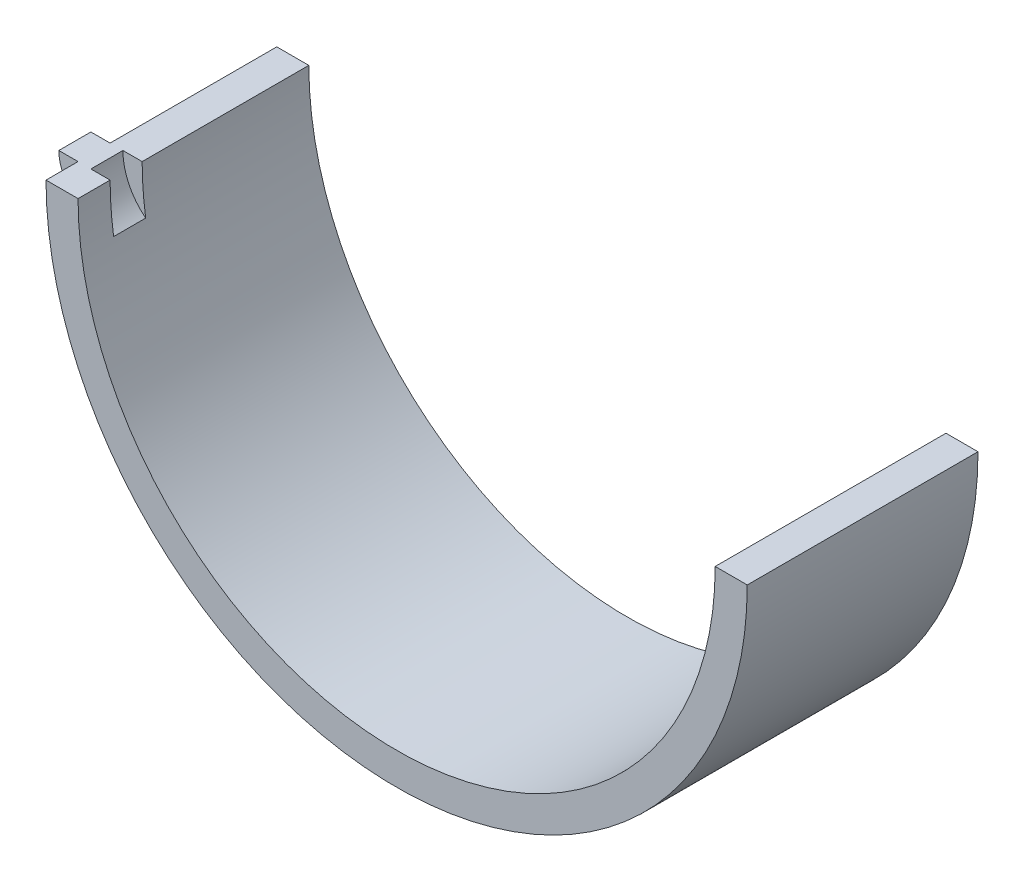
ISO-10303-21;
HEADER;
FILE_DESCRIPTION(('STEP AP214'),'2;1');
FILE_NAME('part.step','',(''),(''),'','','');
FILE_SCHEMA(('AUTOMOTIVE_DESIGN { 1 0 10303 214 1 1 1 1 }'));
ENDSEC;
DATA;
#1=APPLICATION_CONTEXT('core data for automotive mechanical design processes');
#2=APPLICATION_PROTOCOL_DEFINITION('international standard','automotive_design',2000,#1);
#3=PRODUCT_CONTEXT('',#1,'mechanical');
#4=PRODUCT('Part','Part','',(#3));
#5=PRODUCT_RELATED_PRODUCT_CATEGORY('part','',(#4));
#6=PRODUCT_DEFINITION_FORMATION('','',#4);
#7=PRODUCT_DEFINITION_CONTEXT('part definition',#1,'design');
#8=PRODUCT_DEFINITION('design','',#6,#7);
#9=PRODUCT_DEFINITION_SHAPE('','',#8);
#10=(LENGTH_UNIT() NAMED_UNIT(*) SI_UNIT(.MILLI.,.METRE.));
#11=(NAMED_UNIT(*) PLANE_ANGLE_UNIT() SI_UNIT($,.RADIAN.));
#12=(NAMED_UNIT(*) SI_UNIT($,.STERADIAN.) SOLID_ANGLE_UNIT());
#13=UNCERTAINTY_MEASURE_WITH_UNIT(LENGTH_MEASURE(1.E-05),#10,'distance_accuracy_value','');
#14=(GEOMETRIC_REPRESENTATION_CONTEXT(3) GLOBAL_UNCERTAINTY_ASSIGNED_CONTEXT((#13)) GLOBAL_UNIT_ASSIGNED_CONTEXT((#10,
#11,#12)) REPRESENTATION_CONTEXT('',''));
#15=CARTESIAN_POINT('',(0.,0.,0.));
#16=DIRECTION('',(0.,0.,1.));
#17=DIRECTION('',(1.,0.,0.));
#18=AXIS2_PLACEMENT_3D('',#15,#16,#17);
#19=CARTESIAN_POINT('',(-13.8938,13.8938,-9.144));
#20=DIRECTION('',(0.,1.,0.));
#21=DIRECTION('',(-0.999999999999943,0.,0.));
#22=AXIS2_PLACEMENT_3D('',#19,#20,#21);
#23=PLANE('',#22);
#24=DIRECTION('',(0.,0.,1.));
#25=VECTOR('',#24,1.);
#26=CARTESIAN_POINT('',(-13.3858,13.8938,-2.54));
#27=LINE('',#26,#25);
#28=CARTESIAN_POINT('',(-13.3858,13.8938,-2.54));
#29=VERTEX_POINT('',#28);
#30=CARTESIAN_POINT('',(-13.3858,13.8938,-1.26999999999999));
#31=VERTEX_POINT('',#30);
#32=EDGE_CURVE('E133',#29,#31,#27,.T.);
#33=ORIENTED_EDGE('',*,*,#32,.F.);
#34=DIRECTION('',(0.999999999999943,0.,0.));
#35=VECTOR('',#34,1.);
#36=CARTESIAN_POINT('',(-13.3858,13.8938,-2.54));
#37=LINE('',#36,#35);
#38=CARTESIAN_POINT('',(-12.6238,13.8938,-2.54));
#39=VERTEX_POINT('',#38);
#40=EDGE_CURVE('E121',#29,#39,#37,.T.);
#41=ORIENTED_EDGE('',*,*,#40,.T.);
#42=DIRECTION('',(0.,0.,1.));
#43=VECTOR('',#42,1.);
#44=CARTESIAN_POINT('',(-12.6238,13.8938,-9.144));
#45=LINE('',#44,#43);
#46=CARTESIAN_POINT('',(-12.6238,13.8938,-9.144));
#47=VERTEX_POINT('',#46);
#48=EDGE_CURVE('E131',#47,#39,#45,.T.);
#49=ORIENTED_EDGE('',*,*,#48,.F.);
#50=DIRECTION('',(-0.999999999999943,0.,0.));
#51=VECTOR('',#50,1.);
#52=CARTESIAN_POINT('',(-13.8938,13.8938,-9.144));
#53=LINE('',#52,#51);
#54=CARTESIAN_POINT('',(-13.8938,13.8938,-9.144));
#55=VERTEX_POINT('',#54);
#56=EDGE_CURVE('E148',#47,#55,#53,.T.);
#57=ORIENTED_EDGE('',*,*,#56,.T.);
#58=DIRECTION('',(0.,0.,1.));
#59=VECTOR('',#58,1.);
#60=CARTESIAN_POINT('',(-13.8938,13.8938,-9.144));
#61=LINE('',#60,#59);
#62=CARTESIAN_POINT('',(-13.8938,13.8938,-2.54));
#63=VERTEX_POINT('',#62);
#64=EDGE_CURVE('E11',#55,#63,#61,.T.);
#65=ORIENTED_EDGE('',*,*,#64,.T.);
#66=DIRECTION('',(-0.999999999999943,0.,0.));
#67=VECTOR('',#66,1.);
#68=CARTESIAN_POINT('',(-13.8938,13.8938,-2.54));
#69=LINE('',#68,#67);
#70=CARTESIAN_POINT('',(-14.6558,13.8938,-2.54));
#71=VERTEX_POINT('',#70);
#72=EDGE_CURVE('E187',#63,#71,#69,.T.);
#73=ORIENTED_EDGE('',*,*,#72,.T.);
#74=DIRECTION('',(0.,0.,1.));
#75=VECTOR('',#74,1.);
#76=CARTESIAN_POINT('',(-14.6558,13.8938,-2.54));
#77=LINE('',#76,#75);
#78=CARTESIAN_POINT('',(-14.6558,13.8938,-1.26999999999999));
#79=VERTEX_POINT('',#78);
#80=EDGE_CURVE('E174',#71,#79,#77,.T.);
#81=ORIENTED_EDGE('',*,*,#80,.T.);
#82=DIRECTION('',(-0.999999999999943,0.,0.));
#83=VECTOR('',#82,1.);
#84=CARTESIAN_POINT('',(-13.8938,13.8938,-1.26999999999999));
#85=LINE('',#84,#83);
#86=CARTESIAN_POINT('',(-13.8938,13.8938,-1.26999999999999));
#87=VERTEX_POINT('',#86);
#88=EDGE_CURVE('E181',#87,#79,#85,.T.);
#89=ORIENTED_EDGE('',*,*,#88,.F.);
#90=CARTESIAN_POINT('',(-13.8938,13.8938,0.));
#91=VERTEX_POINT('',#90);
#92=EDGE_CURVE('E45',#87,#91,#61,.T.);
#93=ORIENTED_EDGE('',*,*,#92,.T.);
#94=DIRECTION('',(-0.999999999999943,0.,0.));
#95=VECTOR('',#94,1.);
#96=CARTESIAN_POINT('',(-13.8938,13.8938,0.));
#97=LINE('',#96,#95);
#98=CARTESIAN_POINT('',(-12.6238,13.8938,0.));
#99=VERTEX_POINT('',#98);
#100=EDGE_CURVE('E166',#99,#91,#97,.T.);
#101=ORIENTED_EDGE('',*,*,#100,.F.);
#102=CARTESIAN_POINT('',(-12.6238,13.8938,-1.26999999999999));
#103=VERTEX_POINT('',#102);
#104=EDGE_CURVE('E140',#103,#99,#45,.T.);
#105=ORIENTED_EDGE('',*,*,#104,.F.);
#106=DIRECTION('',(0.999999999999943,0.,0.));
#107=VECTOR('',#106,1.);
#108=CARTESIAN_POINT('',(-13.3858,13.8938,-1.26999999999999));
#109=LINE('',#108,#107);
#110=EDGE_CURVE('E53',#31,#103,#109,.T.);
#111=ORIENTED_EDGE('',*,*,#110,.F.);
#112=EDGE_LOOP('',(#33,#41,#49,#57,#65,#73,#81,#89,#93,#101,#105,#111));
#113=FACE_BOUND('',#112,.T.);
#114=ADVANCED_FACE('F36',(#113),#23,.T.);
#115=CARTESIAN_POINT('',(-8.88178419700125E-13,13.8938,-9.144));
#116=DIRECTION('',(0.,0.,1.));
#117=DIRECTION('',(0.999999999999943,0.,0.));
#118=AXIS2_PLACEMENT_3D('',#115,#116,#117);
#119=CYLINDRICAL_SURFACE('',#118,12.6238);
#120=ORIENTED_EDGE('',*,*,#48,.T.);
#121=CARTESIAN_POINT('',(-8.88178419700125E-13,13.8938,-2.54));
#122=DIRECTION('',(0.,0.,1.));
#123=DIRECTION('',(0.999999999999943,0.,0.));
#124=AXIS2_PLACEMENT_3D('',#121,#122,#123);
#125=CIRCLE('',#124,12.6238);
#126=CARTESIAN_POINT('',(-12.4844649423711,12.0233825218131,-2.54));
#127=VERTEX_POINT('',#126);
#128=EDGE_CURVE('E118',#39,#127,#125,.T.);
#129=ORIENTED_EDGE('',*,*,#128,.T.);
#130=DIRECTION('',(0.,0.,1.));
#131=VECTOR('',#130,1.);
#132=CARTESIAN_POINT('',(-12.4844649423711,12.0233825218131,-2.54));
#133=LINE('',#132,#131);
#134=CARTESIAN_POINT('',(-12.4844649423711,12.0233825218131,-1.26999999999999));
#135=VERTEX_POINT('',#134);
#136=EDGE_CURVE('E184',#127,#135,#133,.T.);
#137=ORIENTED_EDGE('',*,*,#136,.T.);
#138=CARTESIAN_POINT('',(-8.88178419700125E-13,13.8938,-1.26999999999999));
#139=DIRECTION('',(0.,0.,1.));
#140=DIRECTION('',(0.999999999999943,0.,0.));
#141=AXIS2_PLACEMENT_3D('',#138,#139,#140);
#142=CIRCLE('',#141,12.6238);
#143=EDGE_CURVE('E196',#103,#135,#142,.T.);
#144=ORIENTED_EDGE('',*,*,#143,.F.);
#145=ORIENTED_EDGE('',*,*,#104,.T.);
#146=CARTESIAN_POINT('',(-8.84708972748172E-13,13.8938,0.));
#147=DIRECTION('',(0.,0.,-1.));
#148=DIRECTION('',(0.999999999999943,0.,0.));
#149=AXIS2_PLACEMENT_3D('',#146,#147,#148);
#150=CIRCLE('',#149,12.6238);
#151=CARTESIAN_POINT('',(12.6237999999982,13.8938,0.));
#152=VERTEX_POINT('',#151);
#153=EDGE_CURVE('E164',#152,#99,#150,.T.);
#154=ORIENTED_EDGE('',*,*,#153,.F.);
#155=DIRECTION('',(0.,0.,1.));
#156=VECTOR('',#155,1.);
#157=CARTESIAN_POINT('',(12.6237999999982,13.8938,-9.144));
#158=LINE('',#157,#156);
#159=CARTESIAN_POINT('',(12.6237999999982,13.8938,-9.144));
#160=VERTEX_POINT('',#159);
#161=EDGE_CURVE('E142',#160,#152,#158,.T.);
#162=ORIENTED_EDGE('',*,*,#161,.F.);
#163=CARTESIAN_POINT('',(-8.88178419700125E-13,13.8938,-9.144));
#164=DIRECTION('',(0.,0.,-1.));
#165=DIRECTION('',(0.999999999999943,0.,0.));
#166=AXIS2_PLACEMENT_3D('',#163,#164,#165);
#167=CIRCLE('',#166,12.6238);
#168=EDGE_CURVE('E138',#160,#47,#167,.T.);
#169=ORIENTED_EDGE('',*,*,#168,.T.);
#170=EDGE_LOOP('',(#120,#129,#137,#144,#145,#154,#162,#169));
#171=FACE_BOUND('',#170,.T.);
#172=ADVANCED_FACE('F136',(#171),#119,.F.);
#173=CARTESIAN_POINT('',(-8.88178419700125E-13,13.8938,-9.144));
#174=DIRECTION('',(0.,0.,1.));
#175=DIRECTION('',(0.999999999999943,0.,0.));
#176=AXIS2_PLACEMENT_3D('',#173,#174,#175);
#177=CYLINDRICAL_SURFACE('',#176,13.8938);
#178=DIRECTION('',(0.,0.,1.));
#179=VECTOR('',#178,1.);
#180=CARTESIAN_POINT('',(-13.8236105397417,12.498998908252,-2.54));
#181=LINE('',#180,#179);
#182=CARTESIAN_POINT('',(-13.8236105397417,12.498998908252,-2.54));
#183=VERTEX_POINT('',#182);
#184=CARTESIAN_POINT('',(-13.8236105397417,12.498998908252,-1.26999999999999));
#185=VERTEX_POINT('',#184);
#186=EDGE_CURVE('E161',#183,#185,#181,.T.);
#187=ORIENTED_EDGE('',*,*,#186,.F.);
#188=CARTESIAN_POINT('',(-8.88178419700125E-13,13.8938,-2.54));
#189=DIRECTION('',(0.,0.,-1.));
#190=DIRECTION('',(0.999999999999943,0.,0.));
#191=AXIS2_PLACEMENT_3D('',#188,#189,#190);
#192=CIRCLE('',#191,13.8938);
#193=EDGE_CURVE('E180',#183,#63,#192,.T.);
#194=ORIENTED_EDGE('',*,*,#193,.T.);
#195=ORIENTED_EDGE('',*,*,#64,.F.);
#196=CARTESIAN_POINT('',(-8.88178419700125E-13,13.8938,-9.144));
#197=DIRECTION('',(0.,0.,1.));
#198=DIRECTION('',(-0.999999999999943,0.,0.));
#199=AXIS2_PLACEMENT_3D('',#196,#197,#198);
#200=CIRCLE('',#199,13.8938);
#201=CARTESIAN_POINT('',(13.8937999999982,13.8938,-9.144));
#202=VERTEX_POINT('',#201);
#203=EDGE_CURVE('E168',#55,#202,#200,.T.);
#204=ORIENTED_EDGE('',*,*,#203,.T.);
#205=DIRECTION('',(0.,0.,1.));
#206=VECTOR('',#205,1.);
#207=CARTESIAN_POINT('',(13.8937999999982,13.8938,-9.144));
#208=LINE('',#207,#206);
#209=CARTESIAN_POINT('',(13.8937999999982,13.8937999999982,0.));
#210=VERTEX_POINT('',#209);
#211=EDGE_CURVE('E40',#202,#210,#208,.T.);
#212=ORIENTED_EDGE('',*,*,#211,.T.);
#213=CARTESIAN_POINT('',(-8.84708972748172E-13,13.8938,0.));
#214=DIRECTION('',(0.,0.,1.));
#215=DIRECTION('',(-0.999999999999943,0.,0.));
#216=AXIS2_PLACEMENT_3D('',#213,#214,#215);
#217=CIRCLE('',#216,13.8938);
#218=EDGE_CURVE('E157',#91,#210,#217,.T.);
#219=ORIENTED_EDGE('',*,*,#218,.F.);
#220=ORIENTED_EDGE('',*,*,#92,.F.);
#221=CARTESIAN_POINT('',(-8.88178419700125E-13,13.8938,-1.26999999999999));
#222=DIRECTION('',(0.,0.,-1.));
#223=DIRECTION('',(0.999999999999943,0.,0.));
#224=AXIS2_PLACEMENT_3D('',#221,#222,#223);
#225=CIRCLE('',#224,13.8938);
#226=EDGE_CURVE('E61',#185,#87,#225,.T.);
#227=ORIENTED_EDGE('',*,*,#226,.F.);
#228=EDGE_LOOP('',(#187,#194,#195,#204,#212,#219,#220,#227));
#229=FACE_BOUND('',#228,.T.);
#230=ADVANCED_FACE('F38',(#229),#177,.T.);
#231=CARTESIAN_POINT('',(13.8937999999982,13.8938,-9.144));
#232=DIRECTION('',(0.,1.,0.));
#233=DIRECTION('',(-0.999999999999943,0.,0.));
#234=AXIS2_PLACEMENT_3D('',#231,#232,#233);
#235=PLANE('',#234);
#236=DIRECTION('',(-0.999999999999943,0.,0.));
#237=VECTOR('',#236,1.);
#238=CARTESIAN_POINT('',(13.8937999999982,13.8937999999982,0.));
#239=LINE('',#238,#237);
#240=EDGE_CURVE('E160',#210,#152,#239,.T.);
#241=ORIENTED_EDGE('',*,*,#240,.F.);
#242=ORIENTED_EDGE('',*,*,#211,.F.);
#243=DIRECTION('',(-0.999999999999943,0.,0.));
#244=VECTOR('',#243,1.);
#245=CARTESIAN_POINT('',(13.8937999999982,13.8938,-9.144));
#246=LINE('',#245,#244);
#247=EDGE_CURVE('E153',#202,#160,#246,.T.);
#248=ORIENTED_EDGE('',*,*,#247,.T.);
#249=ORIENTED_EDGE('',*,*,#161,.T.);
#250=EDGE_LOOP('',(#241,#242,#248,#249));
#251=FACE_BOUND('',#250,.T.);
#252=ADVANCED_FACE('F224',(#251),#235,.T.);
#253=CARTESIAN_POINT('',(-8.88178419700125E-13,13.8938,-9.144));
#254=DIRECTION('',(0.,0.,-1.));
#255=DIRECTION('',(-0.999999999999943,0.,0.));
#256=AXIS2_PLACEMENT_3D('',#253,#254,#255);
#257=PLANE('',#256);
#258=ORIENTED_EDGE('',*,*,#203,.F.);
#259=ORIENTED_EDGE('',*,*,#56,.F.);
#260=ORIENTED_EDGE('',*,*,#168,.F.);
#261=ORIENTED_EDGE('',*,*,#247,.F.);
#262=EDGE_LOOP('',(#258,#259,#260,#261));
#263=FACE_BOUND('',#262,.T.);
#264=ADVANCED_FACE('F226',(#263),#257,.T.);
#265=CARTESIAN_POINT('',(-8.84708972748172E-13,13.8938,0.));
#266=DIRECTION('',(0.,0.,-1.));
#267=DIRECTION('',(-0.999999999999943,0.,0.));
#268=AXIS2_PLACEMENT_3D('',#265,#266,#267);
#269=PLANE('',#268);
#270=ORIENTED_EDGE('',*,*,#218,.T.);
#271=ORIENTED_EDGE('',*,*,#240,.T.);
#272=ORIENTED_EDGE('',*,*,#153,.T.);
#273=ORIENTED_EDGE('',*,*,#100,.T.);
#274=EDGE_LOOP('',(#270,#271,#272,#273));
#275=FACE_BOUND('',#274,.T.);
#276=ADVANCED_FACE('F222',(#275),#269,.F.);
#277=CARTESIAN_POINT('',(-13.0708187491634,13.8938,-2.54));
#278=DIRECTION('',(0.,0.,1.));
#279=DIRECTION('',(0.999999999999943,0.,0.));
#280=AXIS2_PLACEMENT_3D('',#277,#278,#279);
#281=CYLINDRICAL_SURFACE('',#280,1.58498125083665);
#282=CARTESIAN_POINT('',(-13.0708187491634,13.8938,-1.26999999999999));
#283=DIRECTION('',(0.,0.,1.));
#284=DIRECTION('',(-0.999999999999943,0.,0.));
#285=AXIS2_PLACEMENT_3D('',#282,#283,#284);
#286=CIRCLE('',#285,1.58498125083665);
#287=EDGE_CURVE('E178',#79,#185,#286,.T.);
#288=ORIENTED_EDGE('',*,*,#287,.F.);
#289=ORIENTED_EDGE('',*,*,#80,.F.);
#290=CARTESIAN_POINT('',(-13.0708187491634,13.8938,-2.54));
#291=DIRECTION('',(0.,0.,1.));
#292=DIRECTION('',(-0.999999999999943,0.,0.));
#293=AXIS2_PLACEMENT_3D('',#290,#291,#292);
#294=CIRCLE('',#293,1.58498125083665);
#295=EDGE_CURVE('E176',#71,#183,#294,.T.);
#296=ORIENTED_EDGE('',*,*,#295,.T.);
#297=ORIENTED_EDGE('',*,*,#186,.T.);
#298=EDGE_LOOP('',(#288,#289,#296,#297));
#299=FACE_BOUND('',#298,.T.);
#300=ADVANCED_FACE('F237',(#299),#281,.T.);
#301=CARTESIAN_POINT('',(-8.88178419700125E-13,13.8938,-2.54));
#302=DIRECTION('',(0.,0.,1.));
#303=DIRECTION('',(0.999999999999943,0.,0.));
#304=AXIS2_PLACEMENT_3D('',#301,#302,#303);
#305=PLANE('',#304);
#306=ORIENTED_EDGE('',*,*,#193,.F.);
#307=ORIENTED_EDGE('',*,*,#295,.F.);
#308=ORIENTED_EDGE('',*,*,#72,.F.);
#309=EDGE_LOOP('',(#306,#307,#308));
#310=FACE_BOUND('',#309,.T.);
#311=ADVANCED_FACE('F211',(#310),#305,.F.);
#312=CARTESIAN_POINT('',(-8.88178419700125E-13,13.8938,-1.26999999999999));
#313=DIRECTION('',(0.,0.,1.));
#314=DIRECTION('',(0.999999999999943,0.,0.));
#315=AXIS2_PLACEMENT_3D('',#312,#313,#314);
#316=PLANE('',#315);
#317=ORIENTED_EDGE('',*,*,#226,.T.);
#318=ORIENTED_EDGE('',*,*,#88,.T.);
#319=ORIENTED_EDGE('',*,*,#287,.T.);
#320=EDGE_LOOP('',(#317,#318,#319));
#321=FACE_BOUND('',#320,.T.);
#322=ADVANCED_FACE('F204',(#321),#316,.T.);
#323=CARTESIAN_POINT('',(-10.9944215706741,13.8938,-2.54));
#324=DIRECTION('',(0.,0.,1.));
#325=DIRECTION('',(0.999999999999943,0.,0.));
#326=AXIS2_PLACEMENT_3D('',#323,#324,#325);
#327=CYLINDRICAL_SURFACE('',#326,2.39137842932591);
#328=CARTESIAN_POINT('',(-10.9944215706741,13.8938,-1.26999999999999));
#329=DIRECTION('',(0.,0.,1.));
#330=DIRECTION('',(0.999999999999943,0.,0.));
#331=AXIS2_PLACEMENT_3D('',#328,#329,#330);
#332=CIRCLE('',#331,2.39137842932591);
#333=EDGE_CURVE('E134',#31,#135,#332,.T.);
#334=ORIENTED_EDGE('',*,*,#333,.T.);
#335=ORIENTED_EDGE('',*,*,#136,.F.);
#336=CARTESIAN_POINT('',(-10.9944215706741,13.8938,-2.54));
#337=DIRECTION('',(0.,0.,1.));
#338=DIRECTION('',(0.999999999999943,0.,0.));
#339=AXIS2_PLACEMENT_3D('',#336,#337,#338);
#340=CIRCLE('',#339,2.39137842932591);
#341=EDGE_CURVE('E123',#29,#127,#340,.T.);
#342=ORIENTED_EDGE('',*,*,#341,.F.);
#343=ORIENTED_EDGE('',*,*,#32,.T.);
#344=EDGE_LOOP('',(#334,#335,#342,#343));
#345=FACE_BOUND('',#344,.T.);
#346=ADVANCED_FACE('F202',(#345),#327,.F.);
#347=CARTESIAN_POINT('',(-8.88178419700125E-13,13.8938,-2.54));
#348=DIRECTION('',(0.,0.,1.));
#349=DIRECTION('',(0.999999999999943,0.,0.));
#350=AXIS2_PLACEMENT_3D('',#347,#348,#349);
#351=PLANE('',#350);
#352=ORIENTED_EDGE('',*,*,#40,.F.);
#353=ORIENTED_EDGE('',*,*,#341,.T.);
#354=ORIENTED_EDGE('',*,*,#128,.F.);
#355=EDGE_LOOP('',(#352,#353,#354));
#356=FACE_BOUND('',#355,.T.);
#357=ADVANCED_FACE('F120',(#356),#351,.T.);
#358=CARTESIAN_POINT('',(-8.88178419700125E-13,13.8938,-1.26999999999999));
#359=DIRECTION('',(0.,0.,1.));
#360=DIRECTION('',(0.999999999999943,0.,0.));
#361=AXIS2_PLACEMENT_3D('',#358,#359,#360);
#362=PLANE('',#361);
#363=ORIENTED_EDGE('',*,*,#110,.T.);
#364=ORIENTED_EDGE('',*,*,#143,.T.);
#365=ORIENTED_EDGE('',*,*,#333,.F.);
#366=EDGE_LOOP('',(#363,#364,#365));
#367=FACE_BOUND('',#366,.T.);
#368=ADVANCED_FACE('F199',(#367),#362,.F.);
#369=CLOSED_SHELL('',(#114,#172,#230,#252,#264,#276,#300,#311,#322,#346,#357,#368));
#370=MANIFOLD_SOLID_BREP('B2',#369);
#371=ADVANCED_BREP_SHAPE_REPRESENTATION('',(#18,#370),#14);
#372=SHAPE_DEFINITION_REPRESENTATION(#9,#371);
ENDSEC;
END-ISO-10303-21;
